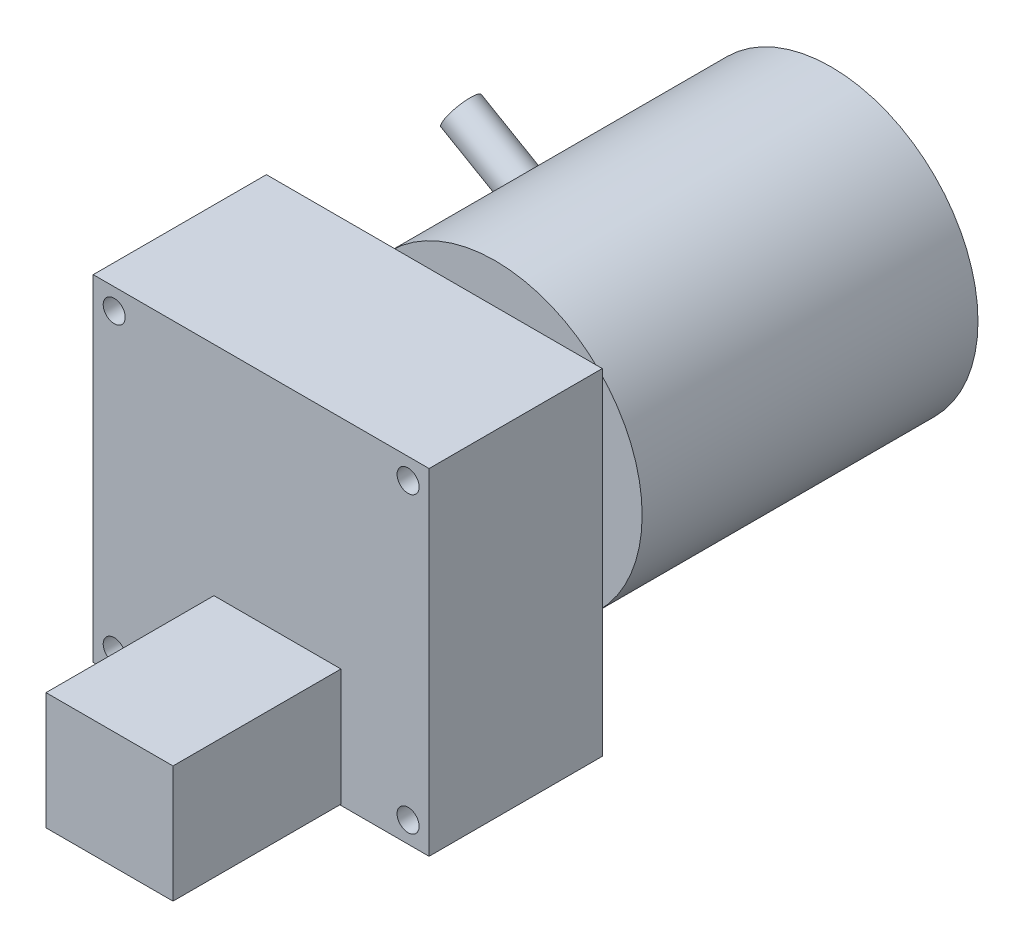
ISO-10303-21;
HEADER;
FILE_DESCRIPTION(('STEP AP214'),'2;1');
FILE_NAME('part.step','',(''),(''),'','','');
FILE_SCHEMA(('AUTOMOTIVE_DESIGN { 1 0 10303 214 1 1 1 1 }'));
ENDSEC;
DATA;
#1=APPLICATION_CONTEXT('core data for automotive mechanical design processes');
#2=APPLICATION_PROTOCOL_DEFINITION('international standard','automotive_design',2000,#1);
#3=PRODUCT_CONTEXT('',#1,'mechanical');
#4=PRODUCT('Part','Part','',(#3));
#5=PRODUCT_RELATED_PRODUCT_CATEGORY('part','',(#4));
#6=PRODUCT_DEFINITION_FORMATION('','',#4);
#7=PRODUCT_DEFINITION_CONTEXT('part definition',#1,'design');
#8=PRODUCT_DEFINITION('design','',#6,#7);
#9=PRODUCT_DEFINITION_SHAPE('','',#8);
#10=(LENGTH_UNIT() NAMED_UNIT(*) SI_UNIT(.MILLI.,.METRE.));
#11=(NAMED_UNIT(*) PLANE_ANGLE_UNIT() SI_UNIT($,.RADIAN.));
#12=(NAMED_UNIT(*) SI_UNIT($,.STERADIAN.) SOLID_ANGLE_UNIT());
#13=UNCERTAINTY_MEASURE_WITH_UNIT(LENGTH_MEASURE(1.E-05),#10,'distance_accuracy_value','');
#14=(GEOMETRIC_REPRESENTATION_CONTEXT(3) GLOBAL_UNCERTAINTY_ASSIGNED_CONTEXT((#13)) GLOBAL_UNIT_ASSIGNED_CONTEXT((#10,
#11,#12)) REPRESENTATION_CONTEXT('',''));
#15=CARTESIAN_POINT('',(0.,0.,0.));
#16=DIRECTION('',(0.,0.,1.));
#17=DIRECTION('',(1.,0.,0.));
#18=AXIS2_PLACEMENT_3D('',#15,#16,#17);
#19=CARTESIAN_POINT('',(0.,0.,32.));
#20=DIRECTION('',(0.,0.,-1.));
#21=DIRECTION('',(-1.,0.,0.));
#22=AXIS2_PLACEMENT_3D('',#19,#20,#21);
#23=CYLINDRICAL_SURFACE('',#22,14.);
#24=CARTESIAN_POINT('',(0.,0.,32.));
#25=DIRECTION('',(0.,0.,1.));
#26=DIRECTION('',(1.,0.,0.));
#27=AXIS2_PLACEMENT_3D('',#24,#25,#26);
#28=CIRCLE('',#27,14.);
#29=CARTESIAN_POINT('',(14.,0.,32.));
#30=VERTEX_POINT('',#29);
#31=EDGE_CURVE('E50',#30,#30,#28,.T.);
#32=ORIENTED_EDGE('',*,*,#31,.F.);
#33=EDGE_LOOP('',(#32));
#34=FACE_BOUND('',#33,.T.);
#35=CARTESIAN_POINT('',(0.,0.,0.));
#36=DIRECTION('',(0.,0.,1.));
#37=DIRECTION('',(1.,0.,0.));
#38=AXIS2_PLACEMENT_3D('',#35,#36,#37);
#39=CIRCLE('',#38,14.);
#40=CARTESIAN_POINT('',(14.,0.,0.));
#41=VERTEX_POINT('',#40);
#42=EDGE_CURVE('E233',#41,#41,#39,.T.);
#43=ORIENTED_EDGE('',*,*,#42,.T.);
#44=EDGE_LOOP('',(#43));
#45=FACE_BOUND('',#44,.T.);
#46=CARTESIAN_POINT('',(-11.1542611992591,8.46064164816729,17.5));
#47=CARTESIAN_POINT('',(-11.1542644977944,8.46063874715701,17.4021146013457));
#48=CARTESIAN_POINT('',(-11.1592871956269,8.45402813258661,17.3041680245666));
#49=CARTESIAN_POINT('',(-11.179169284619,8.42771828634612,17.1110007422168));
#50=CARTESIAN_POINT('',(-11.1940389547028,8.40800537755095,17.0157829936521));
#51=CARTESIAN_POINT('',(-11.232947240612,8.35595269337543,16.8308980825188));
#52=CARTESIAN_POINT('',(-11.256979633216,8.323621487853,16.7412272005169));
#53=CARTESIAN_POINT('',(-11.3131795353597,8.24707297888719,16.5698900837238));
#54=CARTESIAN_POINT('',(-11.3453456541333,8.2028577073903,16.4882224837799));
#55=CARTESIAN_POINT('',(-11.4166744661773,8.10328960052129,16.3347364270145));
#56=CARTESIAN_POINT('',(-11.4558713261373,8.04788220198729,16.2629692383768));
#57=CARTESIAN_POINT('',(-11.5396061278512,7.92734914749021,16.1317640617427));
#58=CARTESIAN_POINT('',(-11.5841443351542,7.86222300831313,16.0723266871337));
#59=CARTESIAN_POINT('',(-11.6770405232561,7.72358075625931,15.9672844943455));
#60=CARTESIAN_POINT('',(-11.725410648464,7.65003761110659,15.9217260684302));
#61=CARTESIAN_POINT('',(-11.8241005280859,7.49659644891667,15.8460321600413));
#62=CARTESIAN_POINT('',(-11.8744202100656,7.41669866786515,15.8158961051514));
#63=CARTESIAN_POINT('',(-11.9750396869328,7.25310920146591,15.7720555521659));
#64=CARTESIAN_POINT('',(-12.0253382057829,7.16943957708802,15.7582658250333));
#65=CARTESIAN_POINT('',(-12.1246100021663,7.00024643049925,15.7472452304744));
#66=CARTESIAN_POINT('',(-12.1735833317575,6.91472298135142,15.7500137116332));
#67=CARTESIAN_POINT('',(-12.2685571124901,6.7447708143868,15.7719626419302));
#68=CARTESIAN_POINT('',(-12.3145726270193,6.66033865088582,15.791051428937));
#69=CARTESIAN_POINT('',(-12.4027999073564,6.49456518754083,15.844955823641));
#70=CARTESIAN_POINT('',(-12.4450116008339,6.4132239464883,15.8797717303168));
#71=CARTESIAN_POINT('',(-12.5248572123764,6.25585855992933,15.9642395449487));
#72=CARTESIAN_POINT('',(-12.5624785073025,6.17984931016529,16.0139311204111));
#73=CARTESIAN_POINT('',(-12.6323627658196,6.03571343687314,16.1267108535512));
#74=CARTESIAN_POINT('',(-12.6646254835437,5.96758717508249,16.189799625628));
#75=CARTESIAN_POINT('',(-12.7235461385014,5.84091578099792,16.3280962730189));
#76=CARTESIAN_POINT('',(-12.7501642616557,5.7824393152295,16.4033840316827));
#77=CARTESIAN_POINT('',(-12.7972192003156,5.67754315662552,16.5636670897477));
#78=CARTESIAN_POINT('',(-12.8176559964455,5.63112350158264,16.6486624195766));
#79=CARTESIAN_POINT('',(-12.8521753716869,5.55188850503085,16.8260186468936));
#80=CARTESIAN_POINT('',(-12.86625524956,5.51907894732615,16.9183826559672));
#81=CARTESIAN_POINT('',(-12.8879446410162,5.46824047156835,17.1078176174688));
#82=CARTESIAN_POINT('',(-12.8955544664263,5.45021084119172,17.2048883428161));
#83=CARTESIAN_POINT('',(-12.9042269329086,5.42964576278027,17.4002802273998));
#84=CARTESIAN_POINT('',(-12.9053333886871,5.42700662637211,17.4985885361622));
#85=CARTESIAN_POINT('',(-12.9011097867615,5.43703915098008,17.6942793507658));
#86=CARTESIAN_POINT('',(-12.8957798662483,5.44971048565451,17.7916618762955));
#87=CARTESIAN_POINT('',(-12.8787453090582,5.48984398574763,17.9824020345045));
#88=CARTESIAN_POINT('',(-12.8670622262198,5.51725613776216,18.0757721306333));
#89=CARTESIAN_POINT('',(-12.8374144431008,5.58589112632218,18.2562269083972));
#90=CARTESIAN_POINT('',(-12.8194495221195,5.62711444809515,18.3433113690686));
#91=CARTESIAN_POINT('',(-12.7772706370098,5.72224311358641,18.5092282506691));
#92=CARTESIAN_POINT('',(-12.7530241739223,5.77621427893157,18.5880146657201));
#93=CARTESIAN_POINT('',(-12.6985722197834,5.89495708546686,18.7346295877545));
#94=CARTESIAN_POINT('',(-12.668366496936,5.9597291467616,18.8024576683076));
#95=CARTESIAN_POINT('',(-12.6021918887842,6.09841660351074,18.9256229311341));
#96=CARTESIAN_POINT('',(-12.5661911353295,6.17238201076296,18.9808867127565));
#97=CARTESIAN_POINT('',(-12.4891351306669,6.32684299353414,19.0768467523437));
#98=CARTESIAN_POINT('',(-12.4480799813617,6.40733843738855,19.1175433039367));
#99=CARTESIAN_POINT('',(-12.3618500201927,6.57215975862457,19.1830924508356));
#100=CARTESIAN_POINT('',(-12.3166866137823,6.65647472365344,19.2079874672221));
#101=CARTESIAN_POINT('',(-12.2232156482781,6.82659603079726,19.2413648624587));
#102=CARTESIAN_POINT('',(-12.1749082310681,6.91240230548407,19.2498479814195));
#103=CARTESIAN_POINT('',(-12.076800570298,7.08240461155838,19.2501469456045));
#104=CARTESIAN_POINT('',(-12.0270127424022,7.16660763123089,19.2420759723976));
#105=CARTESIAN_POINT('',(-11.9271227099325,7.33164725449953,19.2097355705984));
#106=CARTESIAN_POINT('',(-11.8770205055772,7.41248386043687,19.1854661532718));
#107=CARTESIAN_POINT('',(-11.7781461789591,7.56860719203812,19.1214533199552));
#108=CARTESIAN_POINT('',(-11.7293735971711,7.64389585082534,19.0817153244387));
#109=CARTESIAN_POINT('',(-11.6348244736167,7.78705514103801,18.9879050797747));
#110=CARTESIAN_POINT('',(-11.5890479674763,7.85492568426196,18.9338326602168));
#111=CARTESIAN_POINT('',(-11.5018724846721,7.98203718932756,18.8124697492645));
#112=CARTESIAN_POINT('',(-11.4605041267735,8.04121874998036,18.7450950445334));
#113=CARTESIAN_POINT('',(-11.3840859142338,8.14904702500741,18.5992149391798));
#114=CARTESIAN_POINT('',(-11.349037558608,8.19769124062151,18.5207069057564));
#115=CARTESIAN_POINT('',(-11.2865773439817,8.28347795619357,18.3544410541118));
#116=CARTESIAN_POINT('',(-11.2591954972509,8.32057531494273,18.2666486870454));
#117=CARTESIAN_POINT('',(-11.2134491933662,8.38212628267226,18.0846002815837));
#118=CARTESIAN_POINT('',(-11.1950749295721,8.40659364359477,17.9903514004876));
#119=CARTESIAN_POINT('',(-11.1725453650693,8.43649479330955,17.8296790090695));
#120=CARTESIAN_POINT('',(-11.1657029903713,8.44553933975998,17.7642689339237));
#121=CARTESIAN_POINT('',(-11.1565598075245,8.45761372690544,17.6325819250232));
#122=CARTESIAN_POINT('',(-11.154258964918,8.46064361323546,17.5663049978493));
#123=CARTESIAN_POINT('',(-11.1542611992591,8.46064164816729,17.5));
#124=B_SPLINE_CURVE_WITH_KNOTS('',3,(#46,#47,#48,#49,#50,#51,#52,#53,#54,#55,#56,#57,#58,#59,
#60,#61,#62,#63,#64,#65,#66,#67,#68,#69,#70,#71,#72,#73,#74,#75,#76,#77,#78,#79,#80,#81,#82,#83,
#84,#85,#86,#87,#88,#89,#90,#91,#92,#93,#94,#95,#96,#97,#98,#99,#100,#101,#102,#103,#104,#105,
#106,#107,#108,#109,#110,#111,#112,#113,#114,#115,#116,#117,#118,#119,#120,#121,#122,#123),
.UNSPECIFIED.,.T.,.F.,(4,2,2,2,2,2,2,2,2,2,2,2,2,2,2,2,2,2,2,2,2,2,2,2,2,2,2,2,2,2,2,2,2,2,2,2,
2,2,4),(0.,0.293413972235467,0.587134713306667,0.880656316806839,1.17412776565429,
1.46906604284346,1.76401898919805,2.05994730302018,2.35586463237881,2.6502321785902,
2.94458814419076,3.23730165453127,3.53002072970252,3.82352743088963,4.11704759528373,
4.41257388164439,4.70810109433597,5.00375376717306,5.29939219009332,5.59303652464118,
5.88667460028981,6.17932263404913,6.47198095048297,6.76618473680877,7.06039996896368,
7.3562922012464,7.65217846896215,7.94726699749459,8.24234221840968,8.53540671401779,
8.82847100580752,9.12143269480863,9.41439786674974,9.70928090223586,10.0042337880788,
10.3003256839338,10.5960945018741,10.7948469274306,10.9935978449883),.UNSPECIFIED.);
#125=CARTESIAN_POINT('',(-11.1542611992591,8.46064164816729,17.5));
#126=VERTEX_POINT('',#125);
#127=EDGE_CURVE('E11',#126,#126,#124,.T.);
#128=ORIENTED_EDGE('',*,*,#127,.F.);
#129=EDGE_LOOP('',(#128));
#130=FACE_BOUND('',#129,.T.);
#131=ADVANCED_FACE('F38',(#34,#45,#130),#23,.T.);
#132=CARTESIAN_POINT('',(0.,0.,32.));
#133=DIRECTION('',(0.,0.,1.));
#134=DIRECTION('',(1.,0.,0.));
#135=AXIS2_PLACEMENT_3D('',#132,#133,#134);
#136=PLANE('',#135);
#137=ORIENTED_EDGE('',*,*,#31,.T.);
#138=EDGE_LOOP('',(#137));
#139=FACE_BOUND('',#138,.T.);
#140=DIRECTION('',(1.,0.,0.));
#141=VECTOR('',#140,1.);
#142=CARTESIAN_POINT('',(6.,-5.5,32.));
#143=LINE('',#142,#141);
#144=CARTESIAN_POINT('',(-6.,-5.5,32.));
#145=VERTEX_POINT('',#144);
#146=CARTESIAN_POINT('',(6.,-5.5,32.));
#147=VERTEX_POINT('',#146);
#148=EDGE_CURVE('E220',#145,#147,#143,.T.);
#149=ORIENTED_EDGE('',*,*,#148,.F.);
#150=DIRECTION('',(0.,-1.,0.));
#151=VECTOR('',#150,1.);
#152=CARTESIAN_POINT('',(-6.,5.5,32.));
#153=LINE('',#152,#151);
#154=CARTESIAN_POINT('',(-6.,5.5,32.));
#155=VERTEX_POINT('',#154);
#156=EDGE_CURVE('E203',#155,#145,#153,.T.);
#157=ORIENTED_EDGE('',*,*,#156,.F.);
#158=DIRECTION('',(-1.,0.,0.));
#159=VECTOR('',#158,1.);
#160=CARTESIAN_POINT('',(6.,5.5,32.));
#161=LINE('',#160,#159);
#162=CARTESIAN_POINT('',(6.,5.5,32.));
#163=VERTEX_POINT('',#162);
#164=EDGE_CURVE('E208',#163,#155,#161,.T.);
#165=ORIENTED_EDGE('',*,*,#164,.F.);
#166=DIRECTION('',(0.,1.,0.));
#167=VECTOR('',#166,1.);
#168=CARTESIAN_POINT('',(6.,5.5,32.));
#169=LINE('',#168,#167);
#170=EDGE_CURVE('E222',#147,#163,#169,.T.);
#171=ORIENTED_EDGE('',*,*,#170,.F.);
#172=EDGE_LOOP('',(#149,#157,#165,#171));
#173=FACE_BOUND('',#172,.T.);
#174=ADVANCED_FACE('F243',(#139,#173),#136,.T.);
#175=CARTESIAN_POINT('',(0.,0.,0.));
#176=DIRECTION('',(0.,0.,1.));
#177=DIRECTION('',(1.,0.,0.));
#178=AXIS2_PLACEMENT_3D('',#175,#176,#177);
#179=PLANE('',#178);
#180=ORIENTED_EDGE('',*,*,#42,.F.);
#181=EDGE_LOOP('',(#180));
#182=FACE_BOUND('',#181,.T.);
#183=ADVANCED_FACE('F240',(#182),#179,.F.);
#184=CARTESIAN_POINT('',(-6.,5.5,37.8));
#185=DIRECTION('',(1.,0.,0.));
#186=DIRECTION('',(0.,0.,-1.));
#187=AXIS2_PLACEMENT_3D('',#184,#185,#186);
#188=PLANE('',#187);
#189=ORIENTED_EDGE('',*,*,#156,.T.);
#190=DIRECTION('',(0.,0.,-1.));
#191=VECTOR('',#190,1.);
#192=CARTESIAN_POINT('',(-6.,-5.5,37.8));
#193=LINE('',#192,#191);
#194=CARTESIAN_POINT('',(-6.,-5.5,37.8));
#195=VERTEX_POINT('',#194);
#196=EDGE_CURVE('E231',#195,#145,#193,.T.);
#197=ORIENTED_EDGE('',*,*,#196,.F.);
#198=DIRECTION('',(0.,-1.,0.));
#199=VECTOR('',#198,1.);
#200=CARTESIAN_POINT('',(-6.,5.5,37.8));
#201=LINE('',#200,#199);
#202=CARTESIAN_POINT('',(-6.,5.5,37.8));
#203=VERTEX_POINT('',#202);
#204=EDGE_CURVE('E204',#203,#195,#201,.T.);
#205=ORIENTED_EDGE('',*,*,#204,.F.);
#206=DIRECTION('',(0.,0.,-1.));
#207=VECTOR('',#206,1.);
#208=CARTESIAN_POINT('',(-6.,5.5,37.8));
#209=LINE('',#208,#207);
#210=EDGE_CURVE('E217',#203,#155,#209,.T.);
#211=ORIENTED_EDGE('',*,*,#210,.T.);
#212=EDGE_LOOP('',(#189,#197,#205,#211));
#213=FACE_BOUND('',#212,.T.);
#214=ADVANCED_FACE('F242',(#213),#188,.F.);
#215=CARTESIAN_POINT('',(6.,-5.5,37.8));
#216=DIRECTION('',(0.,1.,0.));
#217=DIRECTION('',(0.,0.,1.));
#218=AXIS2_PLACEMENT_3D('',#215,#216,#217);
#219=PLANE('',#218);
#220=ORIENTED_EDGE('',*,*,#148,.T.);
#221=DIRECTION('',(0.,0.,-1.));
#222=VECTOR('',#221,1.);
#223=CARTESIAN_POINT('',(6.,-5.5,37.8));
#224=LINE('',#223,#222);
#225=CARTESIAN_POINT('',(6.,-5.5,37.8));
#226=VERTEX_POINT('',#225);
#227=EDGE_CURVE('E228',#226,#147,#224,.T.);
#228=ORIENTED_EDGE('',*,*,#227,.F.);
#229=DIRECTION('',(1.,0.,0.));
#230=VECTOR('',#229,1.);
#231=CARTESIAN_POINT('',(6.,-5.5,37.8));
#232=LINE('',#231,#230);
#233=EDGE_CURVE('E207',#195,#226,#232,.T.);
#234=ORIENTED_EDGE('',*,*,#233,.F.);
#235=ORIENTED_EDGE('',*,*,#196,.T.);
#236=EDGE_LOOP('',(#220,#228,#234,#235));
#237=FACE_BOUND('',#236,.T.);
#238=ADVANCED_FACE('F248',(#237),#219,.F.);
#239=CARTESIAN_POINT('',(6.,5.5,37.8));
#240=DIRECTION('',(-1.,0.,0.));
#241=DIRECTION('',(0.,-1.,0.));
#242=AXIS2_PLACEMENT_3D('',#239,#240,#241);
#243=PLANE('',#242);
#244=ORIENTED_EDGE('',*,*,#170,.T.);
#245=DIRECTION('',(0.,0.,-1.));
#246=VECTOR('',#245,1.);
#247=CARTESIAN_POINT('',(6.,5.5,37.8));
#248=LINE('',#247,#246);
#249=CARTESIAN_POINT('',(6.,5.5,37.8));
#250=VERTEX_POINT('',#249);
#251=EDGE_CURVE('E65',#250,#163,#248,.T.);
#252=ORIENTED_EDGE('',*,*,#251,.F.);
#253=DIRECTION('',(0.,1.,0.));
#254=VECTOR('',#253,1.);
#255=CARTESIAN_POINT('',(6.,5.5,37.8));
#256=LINE('',#255,#254);
#257=EDGE_CURVE('E211',#226,#250,#256,.T.);
#258=ORIENTED_EDGE('',*,*,#257,.F.);
#259=ORIENTED_EDGE('',*,*,#227,.T.);
#260=EDGE_LOOP('',(#244,#252,#258,#259));
#261=FACE_BOUND('',#260,.T.);
#262=ADVANCED_FACE('F267',(#261),#243,.F.);
#263=CARTESIAN_POINT('',(6.,5.5,37.8));
#264=DIRECTION('',(0.,-1.,0.));
#265=DIRECTION('',(1.,0.,0.));
#266=AXIS2_PLACEMENT_3D('',#263,#264,#265);
#267=PLANE('',#266);
#268=ORIENTED_EDGE('',*,*,#164,.T.);
#269=ORIENTED_EDGE('',*,*,#210,.F.);
#270=DIRECTION('',(-1.,0.,0.));
#271=VECTOR('',#270,1.);
#272=CARTESIAN_POINT('',(6.,5.5,37.8));
#273=LINE('',#272,#271);
#274=EDGE_CURVE('E214',#250,#203,#273,.T.);
#275=ORIENTED_EDGE('',*,*,#274,.F.);
#276=ORIENTED_EDGE('',*,*,#251,.T.);
#277=EDGE_LOOP('',(#268,#269,#275,#276));
#278=FACE_BOUND('',#277,.T.);
#279=ADVANCED_FACE('F271',(#278),#267,.F.);
#280=CARTESIAN_POINT('',(0.,0.,37.8));
#281=DIRECTION('',(0.,0.,-1.));
#282=DIRECTION('',(-1.,0.,0.));
#283=AXIS2_PLACEMENT_3D('',#280,#281,#282);
#284=PLANE('',#283);
#285=CARTESIAN_POINT('',(-14.,14.,37.8));
#286=DIRECTION('',(0.,0.,-1.));
#287=DIRECTION('',(-1.,0.,0.));
#288=AXIS2_PLACEMENT_3D('',#285,#286,#287);
#289=CIRCLE('',#288,1.05);
#290=CARTESIAN_POINT('',(-15.05,14.,37.8));
#291=VERTEX_POINT('',#290);
#292=EDGE_CURVE('E471',#291,#291,#289,.F.);
#293=ORIENTED_EDGE('',*,*,#292,.T.);
#294=EDGE_LOOP('',(#293));
#295=FACE_BOUND('',#294,.T.);
#296=CARTESIAN_POINT('',(-14.,-14.,37.8));
#297=DIRECTION('',(0.,0.,-1.));
#298=DIRECTION('',(-1.,0.,0.));
#299=AXIS2_PLACEMENT_3D('',#296,#297,#298);
#300=CIRCLE('',#299,1.05);
#301=CARTESIAN_POINT('',(-15.05,-14.,37.8));
#302=VERTEX_POINT('',#301);
#303=EDGE_CURVE('E479',#302,#302,#300,.F.);
#304=ORIENTED_EDGE('',*,*,#303,.T.);
#305=EDGE_LOOP('',(#304));
#306=FACE_BOUND('',#305,.T.);
#307=CARTESIAN_POINT('',(14.,-14.,37.8));
#308=DIRECTION('',(0.,0.,-1.));
#309=DIRECTION('',(-1.,0.,0.));
#310=AXIS2_PLACEMENT_3D('',#307,#308,#309);
#311=CIRCLE('',#310,1.05);
#312=CARTESIAN_POINT('',(12.95,-14.,37.8));
#313=VERTEX_POINT('',#312);
#314=EDGE_CURVE('E465',#313,#313,#311,.F.);
#315=ORIENTED_EDGE('',*,*,#314,.T.);
#316=EDGE_LOOP('',(#315));
#317=FACE_BOUND('',#316,.T.);
#318=CARTESIAN_POINT('',(14.,14.,37.8));
#319=DIRECTION('',(0.,0.,-1.));
#320=DIRECTION('',(-1.,0.,0.));
#321=AXIS2_PLACEMENT_3D('',#318,#319,#320);
#322=CIRCLE('',#321,1.05);
#323=CARTESIAN_POINT('',(12.95,14.,37.8));
#324=VERTEX_POINT('',#323);
#325=EDGE_CURVE('E165',#324,#324,#322,.F.);
#326=ORIENTED_EDGE('',*,*,#325,.T.);
#327=EDGE_LOOP('',(#326));
#328=FACE_BOUND('',#327,.T.);
#329=DIRECTION('',(0.,-1.,0.));
#330=VECTOR('',#329,1.);
#331=CARTESIAN_POINT('',(-16.,16.,37.8));
#332=LINE('',#331,#330);
#333=CARTESIAN_POINT('',(-16.,16.,37.8));
#334=VERTEX_POINT('',#333);
#335=CARTESIAN_POINT('',(-16.,-16.,37.8));
#336=VERTEX_POINT('',#335);
#337=EDGE_CURVE('E142',#334,#336,#332,.T.);
#338=ORIENTED_EDGE('',*,*,#337,.F.);
#339=DIRECTION('',(-1.,0.,0.));
#340=VECTOR('',#339,1.);
#341=CARTESIAN_POINT('',(16.,16.,37.8));
#342=LINE('',#341,#340);
#343=CARTESIAN_POINT('',(16.,16.,37.8));
#344=VERTEX_POINT('',#343);
#345=EDGE_CURVE('E178',#344,#334,#342,.T.);
#346=ORIENTED_EDGE('',*,*,#345,.F.);
#347=DIRECTION('',(0.,1.,0.));
#348=VECTOR('',#347,1.);
#349=CARTESIAN_POINT('',(16.,16.,37.8));
#350=LINE('',#349,#348);
#351=CARTESIAN_POINT('',(16.,-16.,37.8));
#352=VERTEX_POINT('',#351);
#353=EDGE_CURVE('E189',#352,#344,#350,.T.);
#354=ORIENTED_EDGE('',*,*,#353,.F.);
#355=DIRECTION('',(1.,0.,0.));
#356=VECTOR('',#355,1.);
#357=CARTESIAN_POINT('',(16.,-16.,37.8));
#358=LINE('',#357,#356);
#359=EDGE_CURVE('E187',#336,#352,#358,.T.);
#360=ORIENTED_EDGE('',*,*,#359,.F.);
#361=EDGE_LOOP('',(#338,#346,#354,#360));
#362=FACE_BOUND('',#361,.T.);
#363=ORIENTED_EDGE('',*,*,#204,.T.);
#364=ORIENTED_EDGE('',*,*,#233,.T.);
#365=ORIENTED_EDGE('',*,*,#257,.T.);
#366=ORIENTED_EDGE('',*,*,#274,.T.);
#367=EDGE_LOOP('',(#363,#364,#365,#366));
#368=FACE_BOUND('',#367,.T.);
#369=ADVANCED_FACE('F269',(#295,#306,#317,#328,#362,#368),#284,.T.);
#370=CARTESIAN_POINT('',(-16.,16.,54.3));
#371=DIRECTION('',(1.,0.,0.));
#372=DIRECTION('',(0.,0.,-1.));
#373=AXIS2_PLACEMENT_3D('',#370,#371,#372);
#374=PLANE('',#373);
#375=ORIENTED_EDGE('',*,*,#337,.T.);
#376=DIRECTION('',(0.,0.,-1.));
#377=VECTOR('',#376,1.);
#378=CARTESIAN_POINT('',(-16.,-16.,54.3));
#379=LINE('',#378,#377);
#380=CARTESIAN_POINT('',(-16.,-16.,54.3));
#381=VERTEX_POINT('',#380);
#382=EDGE_CURVE('E200',#381,#336,#379,.T.);
#383=ORIENTED_EDGE('',*,*,#382,.F.);
#384=DIRECTION('',(0.,-1.,0.));
#385=VECTOR('',#384,1.);
#386=CARTESIAN_POINT('',(-16.,16.,54.3));
#387=LINE('',#386,#385);
#388=CARTESIAN_POINT('',(-16.,16.,54.3));
#389=VERTEX_POINT('',#388);
#390=EDGE_CURVE('E174',#389,#381,#387,.T.);
#391=ORIENTED_EDGE('',*,*,#390,.F.);
#392=DIRECTION('',(0.,0.,-1.));
#393=VECTOR('',#392,1.);
#394=CARTESIAN_POINT('',(-16.,16.,54.3));
#395=LINE('',#394,#393);
#396=EDGE_CURVE('E184',#389,#334,#395,.T.);
#397=ORIENTED_EDGE('',*,*,#396,.T.);
#398=EDGE_LOOP('',(#375,#383,#391,#397));
#399=FACE_BOUND('',#398,.T.);
#400=ADVANCED_FACE('F278',(#399),#374,.F.);
#401=CARTESIAN_POINT('',(16.,-16.,54.3));
#402=DIRECTION('',(0.,1.,0.));
#403=DIRECTION('',(0.,0.,1.));
#404=AXIS2_PLACEMENT_3D('',#401,#402,#403);
#405=PLANE('',#404);
#406=ORIENTED_EDGE('',*,*,#359,.T.);
#407=DIRECTION('',(0.,0.,-1.));
#408=VECTOR('',#407,1.);
#409=CARTESIAN_POINT('',(16.,-16.,54.3));
#410=LINE('',#409,#408);
#411=CARTESIAN_POINT('',(16.,-16.,54.3));
#412=VERTEX_POINT('',#411);
#413=EDGE_CURVE('E197',#412,#352,#410,.T.);
#414=ORIENTED_EDGE('',*,*,#413,.F.);
#415=DIRECTION('',(1.,0.,0.));
#416=VECTOR('',#415,1.);
#417=CARTESIAN_POINT('',(16.,-16.,54.3));
#418=LINE('',#417,#416);
#419=EDGE_CURVE('E177',#381,#412,#418,.T.);
#420=ORIENTED_EDGE('',*,*,#419,.F.);
#421=ORIENTED_EDGE('',*,*,#382,.T.);
#422=EDGE_LOOP('',(#406,#414,#420,#421));
#423=FACE_BOUND('',#422,.T.);
#424=ADVANCED_FACE('F308',(#423),#405,.F.);
#425=CARTESIAN_POINT('',(16.,16.,54.3));
#426=DIRECTION('',(-1.,0.,0.));
#427=DIRECTION('',(0.,0.,1.));
#428=AXIS2_PLACEMENT_3D('',#425,#426,#427);
#429=PLANE('',#428);
#430=ORIENTED_EDGE('',*,*,#353,.T.);
#431=DIRECTION('',(0.,0.,-1.));
#432=VECTOR('',#431,1.);
#433=CARTESIAN_POINT('',(16.,16.,54.3));
#434=LINE('',#433,#432);
#435=CARTESIAN_POINT('',(16.,16.,54.3));
#436=VERTEX_POINT('',#435);
#437=EDGE_CURVE('E194',#436,#344,#434,.T.);
#438=ORIENTED_EDGE('',*,*,#437,.F.);
#439=DIRECTION('',(0.,1.,0.));
#440=VECTOR('',#439,1.);
#441=CARTESIAN_POINT('',(16.,16.,54.3));
#442=LINE('',#441,#440);
#443=EDGE_CURVE('E180',#412,#436,#442,.T.);
#444=ORIENTED_EDGE('',*,*,#443,.F.);
#445=ORIENTED_EDGE('',*,*,#413,.T.);
#446=EDGE_LOOP('',(#430,#438,#444,#445));
#447=FACE_BOUND('',#446,.T.);
#448=ADVANCED_FACE('F317',(#447),#429,.F.);
#449=CARTESIAN_POINT('',(16.,16.,54.3));
#450=DIRECTION('',(0.,-1.,0.));
#451=DIRECTION('',(0.,0.,-1.));
#452=AXIS2_PLACEMENT_3D('',#449,#450,#451);
#453=PLANE('',#452);
#454=ORIENTED_EDGE('',*,*,#345,.T.);
#455=ORIENTED_EDGE('',*,*,#396,.F.);
#456=DIRECTION('',(-1.,0.,0.));
#457=VECTOR('',#456,1.);
#458=CARTESIAN_POINT('',(16.,16.,54.3));
#459=LINE('',#458,#457);
#460=EDGE_CURVE('E182',#436,#389,#459,.T.);
#461=ORIENTED_EDGE('',*,*,#460,.F.);
#462=ORIENTED_EDGE('',*,*,#437,.T.);
#463=EDGE_LOOP('',(#454,#455,#461,#462));
#464=FACE_BOUND('',#463,.T.);
#465=ADVANCED_FACE('F326',(#464),#453,.F.);
#466=CARTESIAN_POINT('',(0.,0.,54.3));
#467=DIRECTION('',(0.,0.,-1.));
#468=DIRECTION('',(-1.,0.,0.));
#469=AXIS2_PLACEMENT_3D('',#466,#467,#468);
#470=PLANE('',#469);
#471=CARTESIAN_POINT('',(-14.,14.,54.3));
#472=DIRECTION('',(0.,0.,1.));
#473=DIRECTION('',(1.,0.,0.));
#474=AXIS2_PLACEMENT_3D('',#471,#472,#473);
#475=CIRCLE('',#474,1.05);
#476=CARTESIAN_POINT('',(-12.95,14.,54.3));
#477=VERTEX_POINT('',#476);
#478=EDGE_CURVE('E474',#477,#477,#475,.T.);
#479=ORIENTED_EDGE('',*,*,#478,.F.);
#480=EDGE_LOOP('',(#479));
#481=FACE_BOUND('',#480,.T.);
#482=CARTESIAN_POINT('',(-14.,-14.,54.3));
#483=DIRECTION('',(0.,0.,1.));
#484=DIRECTION('',(1.,0.,0.));
#485=AXIS2_PLACEMENT_3D('',#482,#483,#484);
#486=CIRCLE('',#485,1.05);
#487=CARTESIAN_POINT('',(-12.95,-14.,54.3));
#488=VERTEX_POINT('',#487);
#489=EDGE_CURVE('E475',#488,#488,#486,.T.);
#490=ORIENTED_EDGE('',*,*,#489,.F.);
#491=EDGE_LOOP('',(#490));
#492=FACE_BOUND('',#491,.T.);
#493=CARTESIAN_POINT('',(14.,-14.,54.3));
#494=DIRECTION('',(0.,0.,1.));
#495=DIRECTION('',(1.,0.,0.));
#496=AXIS2_PLACEMENT_3D('',#493,#494,#495);
#497=CIRCLE('',#496,1.05);
#498=CARTESIAN_POINT('',(15.05,-14.,54.3));
#499=VERTEX_POINT('',#498);
#500=EDGE_CURVE('E468',#499,#499,#497,.T.);
#501=ORIENTED_EDGE('',*,*,#500,.F.);
#502=EDGE_LOOP('',(#501));
#503=FACE_BOUND('',#502,.T.);
#504=CARTESIAN_POINT('',(14.,14.,54.3));
#505=DIRECTION('',(0.,0.,1.));
#506=DIRECTION('',(1.,0.,0.));
#507=AXIS2_PLACEMENT_3D('',#504,#505,#506);
#508=CIRCLE('',#507,1.05);
#509=CARTESIAN_POINT('',(15.05,14.,54.3));
#510=VERTEX_POINT('',#509);
#511=EDGE_CURVE('E478',#510,#510,#508,.T.);
#512=ORIENTED_EDGE('',*,*,#511,.F.);
#513=EDGE_LOOP('',(#512));
#514=FACE_BOUND('',#513,.T.);
#515=DIRECTION('',(0.,-1.,0.));
#516=VECTOR('',#515,1.);
#517=CARTESIAN_POINT('',(7.6,0.,54.3));
#518=LINE('',#517,#516);
#519=CARTESIAN_POINT('',(7.6,-4.74,54.3));
#520=VERTEX_POINT('',#519);
#521=CARTESIAN_POINT('',(7.6,-15.9,54.3));
#522=VERTEX_POINT('',#521);
#523=EDGE_CURVE('E164',#520,#522,#518,.T.);
#524=ORIENTED_EDGE('',*,*,#523,.T.);
#525=DIRECTION('',(-1.,0.,0.));
#526=VECTOR('',#525,1.);
#527=CARTESIAN_POINT('',(0.,-15.9,54.3));
#528=LINE('',#527,#526);
#529=CARTESIAN_POINT('',(-4.5,-15.9,54.3));
#530=VERTEX_POINT('',#529);
#531=EDGE_CURVE('E137',#522,#530,#528,.T.);
#532=ORIENTED_EDGE('',*,*,#531,.T.);
#533=DIRECTION('',(0.,1.,0.));
#534=VECTOR('',#533,1.);
#535=CARTESIAN_POINT('',(-4.5,0.,54.3));
#536=LINE('',#535,#534);
#537=CARTESIAN_POINT('',(-4.5,-4.74,54.3));
#538=VERTEX_POINT('',#537);
#539=EDGE_CURVE('E153',#530,#538,#536,.T.);
#540=ORIENTED_EDGE('',*,*,#539,.T.);
#541=DIRECTION('',(1.,0.,0.));
#542=VECTOR('',#541,1.);
#543=CARTESIAN_POINT('',(0.,-4.74,54.3));
#544=LINE('',#543,#542);
#545=EDGE_CURVE('E57',#538,#520,#544,.T.);
#546=ORIENTED_EDGE('',*,*,#545,.T.);
#547=EDGE_LOOP('',(#524,#532,#540,#546));
#548=FACE_BOUND('',#547,.T.);
#549=ORIENTED_EDGE('',*,*,#390,.T.);
#550=ORIENTED_EDGE('',*,*,#419,.T.);
#551=ORIENTED_EDGE('',*,*,#443,.T.);
#552=ORIENTED_EDGE('',*,*,#460,.T.);
#553=EDGE_LOOP('',(#549,#550,#551,#552));
#554=FACE_BOUND('',#553,.T.);
#555=ADVANCED_FACE('F336',(#481,#492,#503,#514,#548,#554),#470,.F.);
#556=CARTESIAN_POINT('',(0.,-15.9,70.3));
#557=DIRECTION('',(0.,-1.,0.));
#558=DIRECTION('',(0.,0.,-1.));
#559=AXIS2_PLACEMENT_3D('',#556,#557,#558);
#560=PLANE('',#559);
#561=ORIENTED_EDGE('',*,*,#531,.F.);
#562=DIRECTION('',(0.,0.,-1.));
#563=VECTOR('',#562,1.);
#564=CARTESIAN_POINT('',(7.6,-15.9,70.3));
#565=LINE('',#564,#563);
#566=CARTESIAN_POINT('',(7.6,-15.9,70.3));
#567=VERTEX_POINT('',#566);
#568=EDGE_CURVE('E131',#567,#522,#565,.T.);
#569=ORIENTED_EDGE('',*,*,#568,.F.);
#570=DIRECTION('',(-1.,0.,0.));
#571=VECTOR('',#570,1.);
#572=CARTESIAN_POINT('',(0.,-15.9,70.3));
#573=LINE('',#572,#571);
#574=CARTESIAN_POINT('',(-4.5,-15.9,70.3));
#575=VERTEX_POINT('',#574);
#576=EDGE_CURVE('E134',#567,#575,#573,.T.);
#577=ORIENTED_EDGE('',*,*,#576,.T.);
#578=DIRECTION('',(0.,0.,-1.));
#579=VECTOR('',#578,1.);
#580=CARTESIAN_POINT('',(-4.5,-15.9,70.3));
#581=LINE('',#580,#579);
#582=EDGE_CURVE('E162',#575,#530,#581,.T.);
#583=ORIENTED_EDGE('',*,*,#582,.T.);
#584=EDGE_LOOP('',(#561,#569,#577,#583));
#585=FACE_BOUND('',#584,.T.);
#586=ADVANCED_FACE('F133',(#585),#560,.T.);
#587=CARTESIAN_POINT('',(7.6,0.,70.3));
#588=DIRECTION('',(1.,0.,0.));
#589=DIRECTION('',(0.,0.,-1.));
#590=AXIS2_PLACEMENT_3D('',#587,#588,#589);
#591=PLANE('',#590);
#592=ORIENTED_EDGE('',*,*,#523,.F.);
#593=DIRECTION('',(0.,0.,-1.));
#594=VECTOR('',#593,1.);
#595=CARTESIAN_POINT('',(7.6,-4.74,70.3));
#596=LINE('',#595,#594);
#597=CARTESIAN_POINT('',(7.6,-4.74,70.3));
#598=VERTEX_POINT('',#597);
#599=EDGE_CURVE('E143',#598,#520,#596,.T.);
#600=ORIENTED_EDGE('',*,*,#599,.F.);
#601=DIRECTION('',(0.,-1.,0.));
#602=VECTOR('',#601,1.);
#603=CARTESIAN_POINT('',(7.6,0.,70.3));
#604=LINE('',#603,#602);
#605=EDGE_CURVE('E149',#598,#567,#604,.T.);
#606=ORIENTED_EDGE('',*,*,#605,.T.);
#607=ORIENTED_EDGE('',*,*,#568,.T.);
#608=EDGE_LOOP('',(#592,#600,#606,#607));
#609=FACE_BOUND('',#608,.T.);
#610=ADVANCED_FACE('F155',(#609),#591,.T.);
#611=CARTESIAN_POINT('',(0.,-4.74,70.3));
#612=DIRECTION('',(0.,1.,0.));
#613=DIRECTION('',(0.,0.,1.));
#614=AXIS2_PLACEMENT_3D('',#611,#612,#613);
#615=PLANE('',#614);
#616=ORIENTED_EDGE('',*,*,#545,.F.);
#617=DIRECTION('',(0.,0.,-1.));
#618=VECTOR('',#617,1.);
#619=CARTESIAN_POINT('',(-4.5,-4.74,70.3));
#620=LINE('',#619,#618);
#621=CARTESIAN_POINT('',(-4.5,-4.74,70.3));
#622=VERTEX_POINT('',#621);
#623=EDGE_CURVE('E171',#622,#538,#620,.T.);
#624=ORIENTED_EDGE('',*,*,#623,.F.);
#625=DIRECTION('',(1.,0.,0.));
#626=VECTOR('',#625,1.);
#627=CARTESIAN_POINT('',(0.,-4.74,70.3));
#628=LINE('',#627,#626);
#629=EDGE_CURVE('E156',#622,#598,#628,.T.);
#630=ORIENTED_EDGE('',*,*,#629,.T.);
#631=ORIENTED_EDGE('',*,*,#599,.T.);
#632=EDGE_LOOP('',(#616,#624,#630,#631));
#633=FACE_BOUND('',#632,.T.);
#634=ADVANCED_FACE('F356',(#633),#615,.T.);
#635=CARTESIAN_POINT('',(-4.5,0.,70.3));
#636=DIRECTION('',(-1.,0.,0.));
#637=DIRECTION('',(0.,0.,1.));
#638=AXIS2_PLACEMENT_3D('',#635,#636,#637);
#639=PLANE('',#638);
#640=ORIENTED_EDGE('',*,*,#539,.F.);
#641=ORIENTED_EDGE('',*,*,#582,.F.);
#642=DIRECTION('',(0.,1.,0.));
#643=VECTOR('',#642,1.);
#644=CARTESIAN_POINT('',(-4.5,0.,70.3));
#645=LINE('',#644,#643);
#646=EDGE_CURVE('E152',#575,#622,#645,.T.);
#647=ORIENTED_EDGE('',*,*,#646,.T.);
#648=ORIENTED_EDGE('',*,*,#623,.T.);
#649=EDGE_LOOP('',(#640,#641,#647,#648));
#650=FACE_BOUND('',#649,.T.);
#651=ADVANCED_FACE('F365',(#650),#639,.T.);
#652=CARTESIAN_POINT('',(0.,0.,70.3));
#653=DIRECTION('',(0.,0.,1.));
#654=DIRECTION('',(1.,0.,0.));
#655=AXIS2_PLACEMENT_3D('',#652,#653,#654);
#656=PLANE('',#655);
#657=ORIENTED_EDGE('',*,*,#576,.F.);
#658=ORIENTED_EDGE('',*,*,#605,.F.);
#659=ORIENTED_EDGE('',*,*,#629,.F.);
#660=ORIENTED_EDGE('',*,*,#646,.F.);
#661=EDGE_LOOP('',(#657,#658,#659,#660));
#662=FACE_BOUND('',#661,.T.);
#663=ADVANCED_FACE('F147',(#662),#656,.T.);
#664=CARTESIAN_POINT('',(14.,14.,34.8301515190165));
#665=DIRECTION('',(0.,0.,1.));
#666=DIRECTION('',(1.,0.,0.));
#667=AXIS2_PLACEMENT_3D('',#664,#665,#666);
#668=CYLINDRICAL_SURFACE('',#667,1.05);
#669=ORIENTED_EDGE('',*,*,#511,.T.);
#670=EDGE_LOOP('',(#669));
#671=FACE_BOUND('',#670,.T.);
#672=ORIENTED_EDGE('',*,*,#325,.F.);
#673=EDGE_LOOP('',(#672));
#674=FACE_BOUND('',#673,.T.);
#675=ADVANCED_FACE('F383',(#671,#674),#668,.F.);
#676=CARTESIAN_POINT('',(14.,-14.,34.8301515190165));
#677=DIRECTION('',(0.,0.,1.));
#678=DIRECTION('',(1.,0.,0.));
#679=AXIS2_PLACEMENT_3D('',#676,#677,#678);
#680=CYLINDRICAL_SURFACE('',#679,1.05);
#681=ORIENTED_EDGE('',*,*,#500,.T.);
#682=EDGE_LOOP('',(#681));
#683=FACE_BOUND('',#682,.T.);
#684=ORIENTED_EDGE('',*,*,#314,.F.);
#685=EDGE_LOOP('',(#684));
#686=FACE_BOUND('',#685,.T.);
#687=ADVANCED_FACE('F404',(#683,#686),#680,.F.);
#688=CARTESIAN_POINT('',(-14.,-14.,34.8301515190165));
#689=DIRECTION('',(0.,0.,1.));
#690=DIRECTION('',(1.,0.,0.));
#691=AXIS2_PLACEMENT_3D('',#688,#689,#690);
#692=CYLINDRICAL_SURFACE('',#691,1.05);
#693=ORIENTED_EDGE('',*,*,#489,.T.);
#694=EDGE_LOOP('',(#693));
#695=FACE_BOUND('',#694,.T.);
#696=ORIENTED_EDGE('',*,*,#303,.F.);
#697=EDGE_LOOP('',(#696));
#698=FACE_BOUND('',#697,.T.);
#699=ADVANCED_FACE('F414',(#695,#698),#692,.F.);
#700=CARTESIAN_POINT('',(-14.,14.,34.8301515190165));
#701=DIRECTION('',(0.,0.,1.));
#702=DIRECTION('',(1.,0.,0.));
#703=AXIS2_PLACEMENT_3D('',#700,#701,#702);
#704=CYLINDRICAL_SURFACE('',#703,1.05);
#705=ORIENTED_EDGE('',*,*,#478,.T.);
#706=EDGE_LOOP('',(#705));
#707=FACE_BOUND('',#706,.T.);
#708=ORIENTED_EDGE('',*,*,#292,.F.);
#709=EDGE_LOOP('',(#708));
#710=FACE_BOUND('',#709,.T.);
#711=ADVANCED_FACE('F424',(#707,#710),#704,.F.);
#712=CARTESIAN_POINT('',(-17.7504086811287,10.2482032302755,17.5));
#713=DIRECTION('',(0.86602540378444,-0.499999999999998,0.));
#714=DIRECTION('',(0.499999999999998,0.86602540378444,0.));
#715=AXIS2_PLACEMENT_3D('',#712,#713,#714);
#716=CYLINDRICAL_SURFACE('',#715,1.75);
#717=CARTESIAN_POINT('',(-17.7504086811287,10.2482032302755,17.5));
#718=DIRECTION('',(-0.86602540378444,0.499999999999998,0.));
#719=DIRECTION('',(-0.499999999999998,-0.86602540378444,0.));
#720=AXIS2_PLACEMENT_3D('',#717,#718,#719);
#721=CIRCLE('',#720,1.75);
#722=CARTESIAN_POINT('',(-18.6254086811287,8.73265877365269,17.5));
#723=VERTEX_POINT('',#722);
#724=EDGE_CURVE('E464',#723,#723,#721,.T.);
#725=ORIENTED_EDGE('',*,*,#724,.F.);
#726=EDGE_LOOP('',(#725));
#727=FACE_BOUND('',#726,.T.);
#728=ORIENTED_EDGE('',*,*,#127,.T.);
#729=EDGE_LOOP('',(#728));
#730=FACE_BOUND('',#729,.T.);
#731=ADVANCED_FACE('F433',(#727,#730),#716,.T.);
#732=CARTESIAN_POINT('',(-17.7504086811287,10.2482032302755,17.5));
#733=DIRECTION('',(-0.86602540378444,0.499999999999998,0.));
#734=DIRECTION('',(-0.499999999999998,-0.86602540378444,0.));
#735=AXIS2_PLACEMENT_3D('',#732,#733,#734);
#736=PLANE('',#735);
#737=ORIENTED_EDGE('',*,*,#724,.T.);
#738=EDGE_LOOP('',(#737));
#739=FACE_BOUND('',#738,.T.);
#740=ADVANCED_FACE('F448',(#739),#736,.T.);
#741=CLOSED_SHELL('',(#131,#174,#183,#214,#238,#262,#279,#369,#400,#424,#448,#465,#555,#586,
#610,#634,#651,#663,#675,#687,#699,#711,#731,#740));
#742=MANIFOLD_SOLID_BREP('B2',#741);
#743=ADVANCED_BREP_SHAPE_REPRESENTATION('',(#18,#742),#14);
#744=SHAPE_DEFINITION_REPRESENTATION(#9,#743);
ENDSEC;
END-ISO-10303-21;
